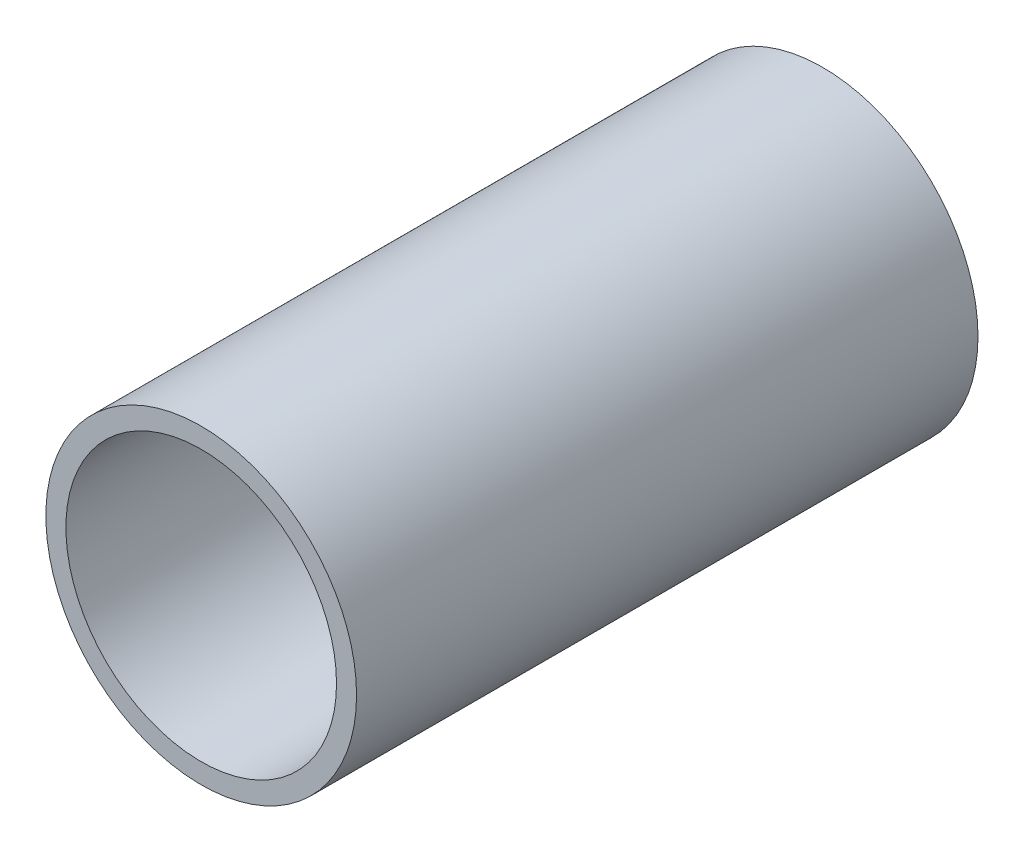
ISO-10303-21;
HEADER;
FILE_DESCRIPTION(('STEP AP214'),'2;1');
FILE_NAME('part.step','',(''),(''),'','','');
FILE_SCHEMA(('AUTOMOTIVE_DESIGN { 1 0 10303 214 1 1 1 1 }'));
ENDSEC;
DATA;
#1=APPLICATION_CONTEXT('core data for automotive mechanical design processes');
#2=APPLICATION_PROTOCOL_DEFINITION('international standard','automotive_design',2000,#1);
#3=PRODUCT_CONTEXT('',#1,'mechanical');
#4=PRODUCT('Part','Part','',(#3));
#5=PRODUCT_RELATED_PRODUCT_CATEGORY('part','',(#4));
#6=PRODUCT_DEFINITION_FORMATION('','',#4);
#7=PRODUCT_DEFINITION_CONTEXT('part definition',#1,'design');
#8=PRODUCT_DEFINITION('design','',#6,#7);
#9=PRODUCT_DEFINITION_SHAPE('','',#8);
#10=(LENGTH_UNIT() NAMED_UNIT(*) SI_UNIT(.MILLI.,.METRE.));
#11=(NAMED_UNIT(*) PLANE_ANGLE_UNIT() SI_UNIT($,.RADIAN.));
#12=(NAMED_UNIT(*) SI_UNIT($,.STERADIAN.) SOLID_ANGLE_UNIT());
#13=UNCERTAINTY_MEASURE_WITH_UNIT(LENGTH_MEASURE(1.E-05),#10,'distance_accuracy_value','');
#14=(GEOMETRIC_REPRESENTATION_CONTEXT(3) GLOBAL_UNCERTAINTY_ASSIGNED_CONTEXT((#13)) GLOBAL_UNIT_ASSIGNED_CONTEXT((#10,
#11,#12)) REPRESENTATION_CONTEXT('',''));
#15=CARTESIAN_POINT('',(0.,0.,0.));
#16=DIRECTION('',(0.,0.,1.));
#17=DIRECTION('',(1.,0.,0.));
#18=AXIS2_PLACEMENT_3D('',#15,#16,#17);
#19=CARTESIAN_POINT('',(0.,0.,31.));
#20=DIRECTION('',(0.,0.,1.));
#21=DIRECTION('',(1.,0.,0.));
#22=AXIS2_PLACEMENT_3D('',#19,#20,#21);
#23=PLANE('',#22);
#24=CARTESIAN_POINT('',(0.,0.,31.));
#25=DIRECTION('',(0.,0.,1.));
#26=DIRECTION('',(1.,0.,0.));
#27=AXIS2_PLACEMENT_3D('',#24,#25,#26);
#28=CIRCLE('',#27,7.75);
#29=CARTESIAN_POINT('',(7.75,0.,31.));
#30=VERTEX_POINT('',#29);
#31=EDGE_CURVE('E10',#30,#30,#28,.T.);
#32=ORIENTED_EDGE('',*,*,#31,.T.);
#33=EDGE_LOOP('',(#32));
#34=FACE_BOUND('',#33,.T.);
#35=CARTESIAN_POINT('',(0.,0.,31.));
#36=DIRECTION('',(0.,0.,1.));
#37=DIRECTION('',(1.,0.,0.));
#38=AXIS2_PLACEMENT_3D('',#35,#36,#37);
#39=CIRCLE('',#38,6.75);
#40=CARTESIAN_POINT('',(6.75,0.,31.));
#41=VERTEX_POINT('',#40);
#42=EDGE_CURVE('E48',#41,#41,#39,.T.);
#43=ORIENTED_EDGE('',*,*,#42,.F.);
#44=EDGE_LOOP('',(#43));
#45=FACE_BOUND('',#44,.T.);
#46=ADVANCED_FACE('F37',(#34,#45),#23,.T.);
#47=CARTESIAN_POINT('',(0.,0.,0.));
#48=DIRECTION('',(0.,0.,1.));
#49=DIRECTION('',(1.,0.,0.));
#50=AXIS2_PLACEMENT_3D('',#47,#48,#49);
#51=PLANE('',#50);
#52=CARTESIAN_POINT('',(0.,0.,0.));
#53=DIRECTION('',(0.,0.,1.));
#54=DIRECTION('',(1.,0.,0.));
#55=AXIS2_PLACEMENT_3D('',#52,#53,#54);
#56=CIRCLE('',#55,7.75);
#57=CARTESIAN_POINT('',(7.75,0.,0.));
#58=VERTEX_POINT('',#57);
#59=EDGE_CURVE('E41',#58,#58,#56,.T.);
#60=ORIENTED_EDGE('',*,*,#59,.F.);
#61=EDGE_LOOP('',(#60));
#62=FACE_BOUND('',#61,.T.);
#63=CARTESIAN_POINT('',(0.,0.,0.));
#64=DIRECTION('',(0.,0.,1.));
#65=DIRECTION('',(1.,0.,0.));
#66=AXIS2_PLACEMENT_3D('',#63,#64,#65);
#67=CIRCLE('',#66,6.75);
#68=CARTESIAN_POINT('',(6.75,0.,0.));
#69=VERTEX_POINT('',#68);
#70=EDGE_CURVE('E50',#69,#69,#67,.T.);
#71=ORIENTED_EDGE('',*,*,#70,.T.);
#72=EDGE_LOOP('',(#71));
#73=FACE_BOUND('',#72,.T.);
#74=ADVANCED_FACE('F60',(#62,#73),#51,.F.);
#75=CARTESIAN_POINT('',(0.,0.,31.));
#76=DIRECTION('',(0.,0.,-1.));
#77=DIRECTION('',(-1.,0.,0.));
#78=AXIS2_PLACEMENT_3D('',#75,#76,#77);
#79=CYLINDRICAL_SURFACE('',#78,7.75);
#80=ORIENTED_EDGE('',*,*,#31,.F.);
#81=EDGE_LOOP('',(#80));
#82=FACE_BOUND('',#81,.T.);
#83=ORIENTED_EDGE('',*,*,#59,.T.);
#84=EDGE_LOOP('',(#83));
#85=FACE_BOUND('',#84,.T.);
#86=ADVANCED_FACE('F39',(#82,#85),#79,.T.);
#87=CARTESIAN_POINT('',(0.,0.,31.));
#88=DIRECTION('',(0.,0.,-1.));
#89=DIRECTION('',(-1.,0.,0.));
#90=AXIS2_PLACEMENT_3D('',#87,#88,#89);
#91=CYLINDRICAL_SURFACE('',#90,6.75);
#92=ORIENTED_EDGE('',*,*,#42,.T.);
#93=EDGE_LOOP('',(#92));
#94=FACE_BOUND('',#93,.T.);
#95=ORIENTED_EDGE('',*,*,#70,.F.);
#96=EDGE_LOOP('',(#95));
#97=FACE_BOUND('',#96,.T.);
#98=ADVANCED_FACE('F56',(#94,#97),#91,.F.);
#99=CLOSED_SHELL('',(#46,#74,#86,#98));
#100=MANIFOLD_SOLID_BREP('B2',#99);
#101=ADVANCED_BREP_SHAPE_REPRESENTATION('',(#18,#100),#14);
#102=SHAPE_DEFINITION_REPRESENTATION(#9,#101);
ENDSEC;
END-ISO-10303-21;
